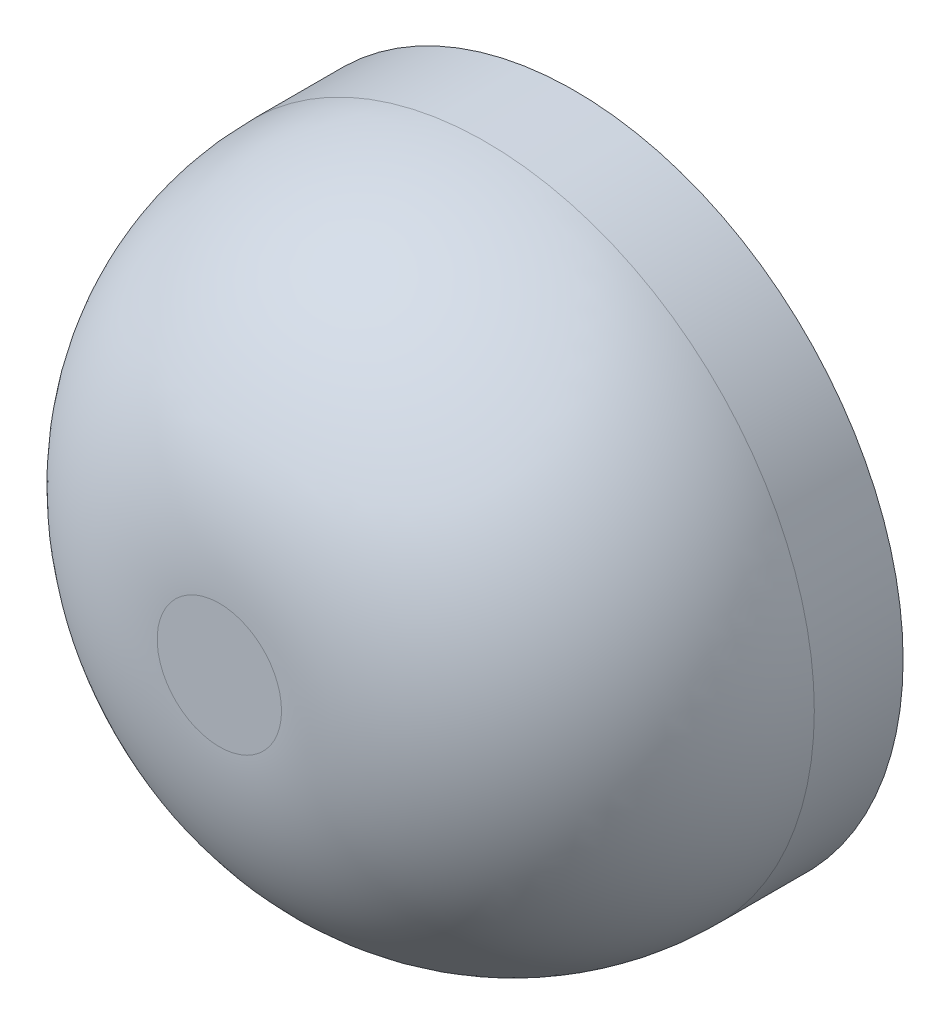
ISO-10303-21;
HEADER;
FILE_DESCRIPTION(('STEP AP214'),'2;1');
FILE_NAME('part.step','',(''),(''),'','','');
FILE_SCHEMA(('AUTOMOTIVE_DESIGN { 1 0 10303 214 1 1 1 1 }'));
ENDSEC;
DATA;
#1=APPLICATION_CONTEXT('core data for automotive mechanical design processes');
#2=APPLICATION_PROTOCOL_DEFINITION('international standard','automotive_design',2000,#1);
#3=PRODUCT_CONTEXT('',#1,'mechanical');
#4=PRODUCT('Part','Part','',(#3));
#5=PRODUCT_RELATED_PRODUCT_CATEGORY('part','',(#4));
#6=PRODUCT_DEFINITION_FORMATION('','',#4);
#7=PRODUCT_DEFINITION_CONTEXT('part definition',#1,'design');
#8=PRODUCT_DEFINITION('design','',#6,#7);
#9=PRODUCT_DEFINITION_SHAPE('','',#8);
#10=(LENGTH_UNIT() NAMED_UNIT(*) SI_UNIT(.MILLI.,.METRE.));
#11=(NAMED_UNIT(*) PLANE_ANGLE_UNIT() SI_UNIT($,.RADIAN.));
#12=(NAMED_UNIT(*) SI_UNIT($,.STERADIAN.) SOLID_ANGLE_UNIT());
#13=UNCERTAINTY_MEASURE_WITH_UNIT(LENGTH_MEASURE(1.E-05),#10,'distance_accuracy_value','');
#14=(GEOMETRIC_REPRESENTATION_CONTEXT(3) GLOBAL_UNCERTAINTY_ASSIGNED_CONTEXT((#13)) GLOBAL_UNIT_ASSIGNED_CONTEXT((#10,
#11,#12)) REPRESENTATION_CONTEXT('',''));
#15=CARTESIAN_POINT('',(0.,0.,0.));
#16=DIRECTION('',(0.,0.,1.));
#17=DIRECTION('',(1.,0.,0.));
#18=AXIS2_PLACEMENT_3D('',#15,#16,#17);
#19=CARTESIAN_POINT('',(0.,0.,20.));
#20=DIRECTION('',(0.,0.,-1.));
#21=DIRECTION('',(-1.,0.,0.));
#22=AXIS2_PLACEMENT_3D('',#19,#20,#21);
#23=CYLINDRICAL_SURFACE('',#22,18.5);
#24=CARTESIAN_POINT('',(0.,0.,5.));
#25=DIRECTION('',(0.,0.,1.));
#26=DIRECTION('',(1.,0.,0.));
#27=AXIS2_PLACEMENT_3D('',#24,#25,#26);
#28=CIRCLE('',#27,18.5);
#29=CARTESIAN_POINT('',(18.5,0.,5.));
#30=VERTEX_POINT('',#29);
#31=EDGE_CURVE('E10',#30,#30,#28,.F.);
#32=ORIENTED_EDGE('',*,*,#31,.T.);
#33=EDGE_LOOP('',(#32));
#34=FACE_BOUND('',#33,.T.);
#35=CARTESIAN_POINT('',(0.,0.,0.));
#36=DIRECTION('',(0.,0.,1.));
#37=DIRECTION('',(1.,0.,0.));
#38=AXIS2_PLACEMENT_3D('',#35,#36,#37);
#39=CIRCLE('',#38,18.5);
#40=CARTESIAN_POINT('',(18.5,0.,0.));
#41=VERTEX_POINT('',#40);
#42=EDGE_CURVE('E49',#41,#41,#39,.T.);
#43=ORIENTED_EDGE('',*,*,#42,.T.);
#44=EDGE_LOOP('',(#43));
#45=FACE_BOUND('',#44,.T.);
#46=ADVANCED_FACE('F39',(#34,#45),#23,.T.);
#47=CARTESIAN_POINT('',(0.,0.,20.));
#48=DIRECTION('',(0.,0.,1.));
#49=DIRECTION('',(1.,0.,0.));
#50=AXIS2_PLACEMENT_3D('',#47,#48,#49);
#51=PLANE('',#50);
#52=CARTESIAN_POINT('',(0.,0.,20.));
#53=DIRECTION('',(0.,0.,1.));
#54=DIRECTION('',(1.,0.,0.));
#55=AXIS2_PLACEMENT_3D('',#52,#53,#54);
#56=CIRCLE('',#55,3.5);
#57=CARTESIAN_POINT('',(3.5,0.,20.));
#58=VERTEX_POINT('',#57);
#59=EDGE_CURVE('E46',#58,#58,#56,.T.);
#60=ORIENTED_EDGE('',*,*,#59,.T.);
#61=EDGE_LOOP('',(#60));
#62=FACE_BOUND('',#61,.T.);
#63=ADVANCED_FACE('F78',(#62),#51,.T.);
#64=CARTESIAN_POINT('',(0.,0.,0.));
#65=DIRECTION('',(0.,0.,1.));
#66=DIRECTION('',(1.,0.,0.));
#67=AXIS2_PLACEMENT_3D('',#64,#65,#66);
#68=PLANE('',#67);
#69=CARTESIAN_POINT('',(0.,0.,0.));
#70=DIRECTION('',(0.,0.,1.));
#71=DIRECTION('',(1.,0.,0.));
#72=AXIS2_PLACEMENT_3D('',#69,#70,#71);
#73=CIRCLE('',#72,16.5);
#74=CARTESIAN_POINT('',(16.5,0.,0.));
#75=VERTEX_POINT('',#74);
#76=EDGE_CURVE('E60',#75,#75,#73,.T.);
#77=ORIENTED_EDGE('',*,*,#76,.T.);
#78=EDGE_LOOP('',(#77));
#79=FACE_BOUND('',#78,.T.);
#80=ORIENTED_EDGE('',*,*,#42,.F.);
#81=EDGE_LOOP('',(#80));
#82=FACE_BOUND('',#81,.T.);
#83=ADVANCED_FACE('F79',(#79,#82),#68,.F.);
#84=CARTESIAN_POINT('',(0.,0.,5.));
#85=DIRECTION('',(0.,0.,1.));
#86=DIRECTION('',(1.,0.,0.));
#87=AXIS2_PLACEMENT_3D('',#84,#85,#86);
#88=DEGENERATE_TOROIDAL_SURFACE('',#87,3.5,15.,.T.);
#89=ORIENTED_EDGE('',*,*,#31,.F.);
#90=EDGE_LOOP('',(#89));
#91=FACE_BOUND('',#90,.T.);
#92=ORIENTED_EDGE('',*,*,#59,.F.);
#93=EDGE_LOOP('',(#92));
#94=FACE_BOUND('',#93,.T.);
#95=ADVANCED_FACE('F41',(#91,#94),#88,.T.);
#96=CARTESIAN_POINT('',(0.,0.,20.));
#97=DIRECTION('',(0.,0.,-1.));
#98=DIRECTION('',(-1.,0.,0.));
#99=AXIS2_PLACEMENT_3D('',#96,#97,#98);
#100=CYLINDRICAL_SURFACE('',#99,16.5);
#101=CARTESIAN_POINT('',(0.,0.,5.));
#102=DIRECTION('',(0.,0.,-1.));
#103=DIRECTION('',(-1.,0.,0.));
#104=AXIS2_PLACEMENT_3D('',#101,#102,#103);
#105=CIRCLE('',#104,16.5);
#106=CARTESIAN_POINT('',(-16.5,0.,5.));
#107=VERTEX_POINT('',#106);
#108=EDGE_CURVE('E53',#107,#107,#105,.T.);
#109=ORIENTED_EDGE('',*,*,#108,.F.);
#110=EDGE_LOOP('',(#109));
#111=FACE_BOUND('',#110,.T.);
#112=ORIENTED_EDGE('',*,*,#76,.F.);
#113=EDGE_LOOP('',(#112));
#114=FACE_BOUND('',#113,.T.);
#115=ADVANCED_FACE('F66',(#111,#114),#100,.F.);
#116=CARTESIAN_POINT('',(0.,0.,18.));
#117=DIRECTION('',(0.,0.,1.));
#118=DIRECTION('',(1.,0.,0.));
#119=AXIS2_PLACEMENT_3D('',#116,#117,#118);
#120=PLANE('',#119);
#121=CARTESIAN_POINT('',(0.,0.,18.));
#122=DIRECTION('',(0.,0.,1.));
#123=DIRECTION('',(1.,0.,0.));
#124=AXIS2_PLACEMENT_3D('',#121,#122,#123);
#125=CIRCLE('',#124,3.5);
#126=CARTESIAN_POINT('',(3.5,0.,18.));
#127=VERTEX_POINT('',#126);
#128=EDGE_CURVE('E58',#127,#127,#125,.T.);
#129=ORIENTED_EDGE('',*,*,#128,.F.);
#130=EDGE_LOOP('',(#129));
#131=FACE_BOUND('',#130,.T.);
#132=ADVANCED_FACE('F75',(#131),#120,.F.);
#133=CARTESIAN_POINT('',(0.,0.,5.));
#134=DIRECTION('',(0.,0.,1.));
#135=DIRECTION('',(1.,0.,0.));
#136=AXIS2_PLACEMENT_3D('',#133,#134,#135);
#137=DEGENERATE_TOROIDAL_SURFACE('',#136,3.5,13.,.T.);
#138=ORIENTED_EDGE('',*,*,#108,.T.);
#139=EDGE_LOOP('',(#138));
#140=FACE_BOUND('',#139,.T.);
#141=ORIENTED_EDGE('',*,*,#128,.T.);
#142=EDGE_LOOP('',(#141));
#143=FACE_BOUND('',#142,.T.);
#144=ADVANCED_FACE('F67',(#140,#143),#137,.F.);
#145=CLOSED_SHELL('',(#46,#63,#83,#95,#115,#132,#144));
#146=MANIFOLD_SOLID_BREP('B2',#145);
#147=ADVANCED_BREP_SHAPE_REPRESENTATION('',(#18,#146),#14);
#148=SHAPE_DEFINITION_REPRESENTATION(#9,#147);
ENDSEC;
END-ISO-10303-21;
